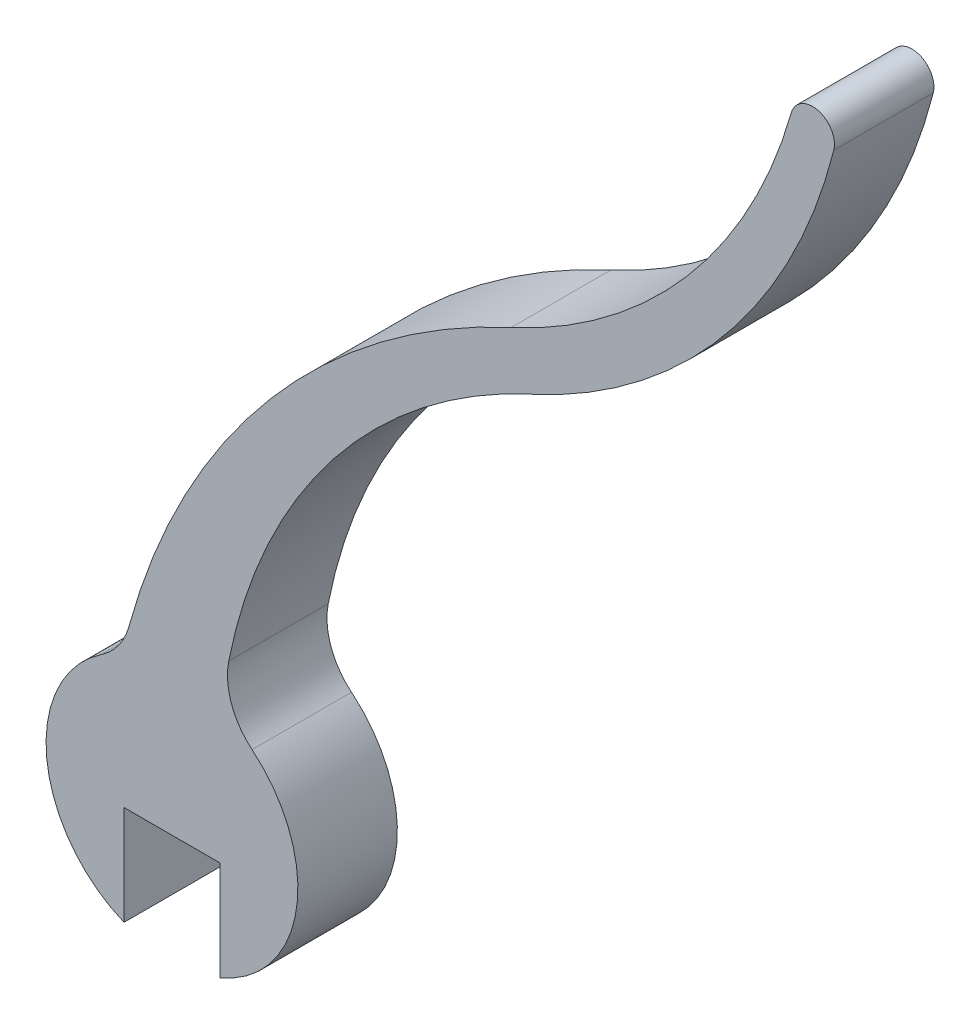
ISO-10303-21;
HEADER;
FILE_DESCRIPTION(('STEP AP214'),'2;1');
FILE_NAME('part.step','',(''),(''),'','','');
FILE_SCHEMA(('AUTOMOTIVE_DESIGN { 1 0 10303 214 1 1 1 1 }'));
ENDSEC;
DATA;
#1=APPLICATION_CONTEXT('core data for automotive mechanical design processes');
#2=APPLICATION_PROTOCOL_DEFINITION('international standard','automotive_design',2000,#1);
#3=PRODUCT_CONTEXT('',#1,'mechanical');
#4=PRODUCT('Part','Part','',(#3));
#5=PRODUCT_RELATED_PRODUCT_CATEGORY('part','',(#4));
#6=PRODUCT_DEFINITION_FORMATION('','',#4);
#7=PRODUCT_DEFINITION_CONTEXT('part definition',#1,'design');
#8=PRODUCT_DEFINITION('design','',#6,#7);
#9=PRODUCT_DEFINITION_SHAPE('','',#8);
#10=(LENGTH_UNIT() NAMED_UNIT(*) SI_UNIT(.MILLI.,.METRE.));
#11=(NAMED_UNIT(*) PLANE_ANGLE_UNIT() SI_UNIT($,.RADIAN.));
#12=(NAMED_UNIT(*) SI_UNIT($,.STERADIAN.) SOLID_ANGLE_UNIT());
#13=UNCERTAINTY_MEASURE_WITH_UNIT(LENGTH_MEASURE(1.E-05),#10,'distance_accuracy_value','');
#14=(GEOMETRIC_REPRESENTATION_CONTEXT(3) GLOBAL_UNCERTAINTY_ASSIGNED_CONTEXT((#13)) GLOBAL_UNIT_ASSIGNED_CONTEXT((#10,
#11,#12)) REPRESENTATION_CONTEXT('',''));
#15=CARTESIAN_POINT('',(0.,0.,0.));
#16=DIRECTION('',(0.,0.,1.));
#17=DIRECTION('',(1.,0.,0.));
#18=AXIS2_PLACEMENT_3D('',#15,#16,#17);
#19=CARTESIAN_POINT('',(-21.2557120556553,-27.0236523147956,3.));
#20=DIRECTION('',(0.,0.,-1.));
#21=DIRECTION('',(-1.,0.,0.));
#22=AXIS2_PLACEMENT_3D('',#19,#20,#21);
#23=CYLINDRICAL_SURFACE('',#22,3.79772962394274);
#24=CARTESIAN_POINT('',(-21.2557120556553,-27.0236523147956,3.));
#25=DIRECTION('',(0.,0.,1.));
#26=DIRECTION('',(1.,0.,0.));
#27=AXIS2_PLACEMENT_3D('',#24,#25,#26);
#28=CIRCLE('',#27,3.79772962394274);
#29=CARTESIAN_POINT('',(-23.3763798191613,-23.8731732189439,3.));
#30=VERTEX_POINT('',#29);
#31=CARTESIAN_POINT('',(-22.7032120556553,-30.5347054397956,3.));
#32=VERTEX_POINT('',#31);
#33=EDGE_CURVE('E128',#30,#32,#28,.T.);
#34=ORIENTED_EDGE('',*,*,#33,.F.);
#35=DIRECTION('',(0.,0.,-1.));
#36=VECTOR('',#35,1.);
#37=CARTESIAN_POINT('',(-23.3763798191613,-23.8731732189439,3.));
#38=LINE('',#37,#36);
#39=CARTESIAN_POINT('',(-23.3763798191613,-23.8731732189439,0.));
#40=VERTEX_POINT('',#39);
#41=EDGE_CURVE('E156',#30,#40,#38,.T.);
#42=ORIENTED_EDGE('',*,*,#41,.T.);
#43=CARTESIAN_POINT('',(-21.2557120556553,-27.0236523147956,0.));
#44=DIRECTION('',(0.,0.,1.));
#45=DIRECTION('',(1.,0.,0.));
#46=AXIS2_PLACEMENT_3D('',#43,#44,#45);
#47=CIRCLE('',#46,3.79772962394274);
#48=CARTESIAN_POINT('',(-22.7032120556553,-30.5347054397956,0.));
#49=VERTEX_POINT('',#48);
#50=EDGE_CURVE('E152',#40,#49,#47,.T.);
#51=ORIENTED_EDGE('',*,*,#50,.T.);
#52=DIRECTION('',(0.,0.,-1.));
#53=VECTOR('',#52,1.);
#54=CARTESIAN_POINT('',(-22.7032120556553,-30.5347054397956,3.));
#55=LINE('',#54,#53);
#56=EDGE_CURVE('E150',#32,#49,#55,.T.);
#57=ORIENTED_EDGE('',*,*,#56,.F.);
#58=EDGE_LOOP('',(#34,#42,#51,#57));
#59=FACE_BOUND('',#58,.T.);
#60=ADVANCED_FACE('F45',(#59),#23,.T.);
#61=CARTESIAN_POINT('',(-22.7032120556553,-30.5347054397956,3.));
#62=DIRECTION('',(-1.,0.,0.));
#63=DIRECTION('',(0.,0.,1.));
#64=AXIS2_PLACEMENT_3D('',#61,#62,#63);
#65=PLANE('',#64);
#66=DIRECTION('',(0.,1.,0.));
#67=VECTOR('',#66,1.);
#68=CARTESIAN_POINT('',(-22.7032120556553,-30.5347054397956,0.));
#69=LINE('',#68,#67);
#70=CARTESIAN_POINT('',(-22.7032120556553,-27.5347054397956,0.));
#71=VERTEX_POINT('',#70);
#72=EDGE_CURVE('E344',#49,#71,#69,.T.);
#73=ORIENTED_EDGE('',*,*,#72,.T.);
#74=DIRECTION('',(0.,0.,-1.));
#75=VECTOR('',#74,1.);
#76=CARTESIAN_POINT('',(-22.7032120556553,-27.5347054397956,3.));
#77=LINE('',#76,#75);
#78=CARTESIAN_POINT('',(-22.7032120556553,-27.5347054397956,3.));
#79=VERTEX_POINT('',#78);
#80=EDGE_CURVE('E149',#79,#71,#77,.T.);
#81=ORIENTED_EDGE('',*,*,#80,.F.);
#82=DIRECTION('',(0.,1.,0.));
#83=VECTOR('',#82,1.);
#84=CARTESIAN_POINT('',(-22.7032120556553,-30.5347054397956,3.));
#85=LINE('',#84,#83);
#86=EDGE_CURVE('E133',#32,#79,#85,.T.);
#87=ORIENTED_EDGE('',*,*,#86,.F.);
#88=ORIENTED_EDGE('',*,*,#56,.T.);
#89=EDGE_LOOP('',(#73,#81,#87,#88));
#90=FACE_BOUND('',#89,.T.);
#91=ADVANCED_FACE('F148',(#90),#65,.F.);
#92=CARTESIAN_POINT('',(-22.7032120556553,-27.5347054397956,3.));
#93=DIRECTION('',(0.,1.,0.));
#94=DIRECTION('',(0.,0.,1.));
#95=AXIS2_PLACEMENT_3D('',#92,#93,#94);
#96=PLANE('',#95);
#97=DIRECTION('',(1.,0.,0.));
#98=VECTOR('',#97,1.);
#99=CARTESIAN_POINT('',(-22.7032120556553,-27.5347054397956,0.));
#100=LINE('',#99,#98);
#101=CARTESIAN_POINT('',(-19.8082120556553,-27.5347054397956,0.));
#102=VERTEX_POINT('',#101);
#103=EDGE_CURVE('E339',#71,#102,#100,.T.);
#104=ORIENTED_EDGE('',*,*,#103,.T.);
#105=DIRECTION('',(0.,0.,-1.));
#106=VECTOR('',#105,1.);
#107=CARTESIAN_POINT('',(-19.8082120556553,-27.5347054397956,3.));
#108=LINE('',#107,#106);
#109=CARTESIAN_POINT('',(-19.8082120556553,-27.5347054397956,3.));
#110=VERTEX_POINT('',#109);
#111=EDGE_CURVE('E159',#110,#102,#108,.T.);
#112=ORIENTED_EDGE('',*,*,#111,.F.);
#113=DIRECTION('',(1.,0.,0.));
#114=VECTOR('',#113,1.);
#115=CARTESIAN_POINT('',(-22.7032120556553,-27.5347054397956,3.));
#116=LINE('',#115,#114);
#117=EDGE_CURVE('E151',#79,#110,#116,.T.);
#118=ORIENTED_EDGE('',*,*,#117,.F.);
#119=ORIENTED_EDGE('',*,*,#80,.T.);
#120=EDGE_LOOP('',(#104,#112,#118,#119));
#121=FACE_BOUND('',#120,.T.);
#122=ADVANCED_FACE('F199',(#121),#96,.F.);
#123=CARTESIAN_POINT('',(-19.8082120556553,-30.5347054397956,3.));
#124=DIRECTION('',(1.,0.,0.));
#125=DIRECTION('',(0.,0.,-1.));
#126=AXIS2_PLACEMENT_3D('',#123,#124,#125);
#127=PLANE('',#126);
#128=DIRECTION('',(0.,-1.,0.));
#129=VECTOR('',#128,1.);
#130=CARTESIAN_POINT('',(-19.8082120556553,-30.5347054397956,0.));
#131=LINE('',#130,#129);
#132=CARTESIAN_POINT('',(-19.8082120556553,-30.5347054397956,0.));
#133=VERTEX_POINT('',#132);
#134=EDGE_CURVE('E340',#102,#133,#131,.T.);
#135=ORIENTED_EDGE('',*,*,#134,.T.);
#136=DIRECTION('',(0.,0.,-1.));
#137=VECTOR('',#136,1.);
#138=CARTESIAN_POINT('',(-19.8082120556553,-30.5347054397956,3.));
#139=LINE('',#138,#137);
#140=CARTESIAN_POINT('',(-19.8082120556553,-30.5347054397956,3.));
#141=VERTEX_POINT('',#140);
#142=EDGE_CURVE('E329',#141,#133,#139,.T.);
#143=ORIENTED_EDGE('',*,*,#142,.F.);
#144=DIRECTION('',(0.,-1.,0.));
#145=VECTOR('',#144,1.);
#146=CARTESIAN_POINT('',(-19.8082120556553,-30.5347054397956,3.));
#147=LINE('',#146,#145);
#148=EDGE_CURVE('E337',#110,#141,#147,.T.);
#149=ORIENTED_EDGE('',*,*,#148,.F.);
#150=ORIENTED_EDGE('',*,*,#111,.T.);
#151=EDGE_LOOP('',(#135,#143,#149,#150));
#152=FACE_BOUND('',#151,.T.);
#153=ADVANCED_FACE('F202',(#152),#127,.F.);
#154=CARTESIAN_POINT('',(-21.2557120556553,-27.0236523147956,3.));
#155=DIRECTION('',(0.,0.,-1.));
#156=DIRECTION('',(-1.,0.,0.));
#157=AXIS2_PLACEMENT_3D('',#154,#155,#156);
#158=CYLINDRICAL_SURFACE('',#157,3.79772962394274);
#159=CARTESIAN_POINT('',(-21.2557120556553,-27.0236523147956,0.));
#160=DIRECTION('',(0.,0.,1.));
#161=DIRECTION('',(-1.,0.,0.));
#162=AXIS2_PLACEMENT_3D('',#159,#160,#161);
#163=CIRCLE('',#162,3.79772962394274);
#164=CARTESIAN_POINT('',(-18.8412101866553,-24.0922821537331,0.));
#165=VERTEX_POINT('',#164);
#166=EDGE_CURVE('E343',#133,#165,#163,.T.);
#167=ORIENTED_EDGE('',*,*,#166,.T.);
#168=DIRECTION('',(0.,0.,-1.));
#169=VECTOR('',#168,1.);
#170=CARTESIAN_POINT('',(-18.8412101866553,-24.0922821537331,3.));
#171=LINE('',#170,#169);
#172=CARTESIAN_POINT('',(-18.8412101866553,-24.0922821537331,3.));
#173=VERTEX_POINT('',#172);
#174=EDGE_CURVE('E60',#165,#173,#171,.F.);
#175=ORIENTED_EDGE('',*,*,#174,.T.);
#176=CARTESIAN_POINT('',(-21.2557120556553,-27.0236523147956,3.));
#177=DIRECTION('',(0.,0.,1.));
#178=DIRECTION('',(-1.,0.,0.));
#179=AXIS2_PLACEMENT_3D('',#176,#177,#178);
#180=CIRCLE('',#179,3.79772962394274);
#181=EDGE_CURVE('E371',#141,#173,#180,.T.);
#182=ORIENTED_EDGE('',*,*,#181,.F.);
#183=ORIENTED_EDGE('',*,*,#142,.T.);
#184=EDGE_LOOP('',(#167,#175,#182,#183));
#185=FACE_BOUND('',#184,.T.);
#186=ADVANCED_FACE('F207',(#185),#158,.T.);
#187=CARTESIAN_POINT('',(-3.76442317922943,-25.2401997131939,3.));
#188=DIRECTION('',(0.,0.,-1.));
#189=DIRECTION('',(-1.,0.,0.));
#190=AXIS2_PLACEMENT_3D('',#187,#188,#189);
#191=CYLINDRICAL_SURFACE('',#190,16.0819784431486);
#192=CARTESIAN_POINT('',(-3.76442317922943,-25.2401997131939,3.));
#193=DIRECTION('',(0.,0.,-1.));
#194=DIRECTION('',(-1.,0.,0.));
#195=AXIS2_PLACEMENT_3D('',#192,#193,#194);
#196=CIRCLE('',#195,16.0819784431486);
#197=CARTESIAN_POINT('',(-19.5429766828782,-22.1309747328512,3.));
#198=VERTEX_POINT('',#197);
#199=CARTESIAN_POINT('',(-10.4266694309731,-10.6031062337144,3.));
#200=VERTEX_POINT('',#199);
#201=EDGE_CURVE('E356',#198,#200,#196,.T.);
#202=ORIENTED_EDGE('',*,*,#201,.F.);
#203=DIRECTION('',(0.,0.,-1.));
#204=VECTOR('',#203,1.);
#205=CARTESIAN_POINT('',(-19.5429766828782,-22.1309747328512,3.));
#206=LINE('',#205,#204);
#207=CARTESIAN_POINT('',(-19.5429766828782,-22.1309747328512,0.));
#208=VERTEX_POINT('',#207);
#209=EDGE_CURVE('E164',#198,#208,#206,.T.);
#210=ORIENTED_EDGE('',*,*,#209,.T.);
#211=CARTESIAN_POINT('',(-3.76442317922943,-25.2401997131939,0.));
#212=DIRECTION('',(0.,0.,-1.));
#213=DIRECTION('',(-1.,0.,0.));
#214=AXIS2_PLACEMENT_3D('',#211,#212,#213);
#215=CIRCLE('',#214,16.0819784431486);
#216=CARTESIAN_POINT('',(-10.4266694309731,-10.6031062337144,0.));
#217=VERTEX_POINT('',#216);
#218=EDGE_CURVE('E341',#208,#217,#215,.T.);
#219=ORIENTED_EDGE('',*,*,#218,.T.);
#220=DIRECTION('',(0.,0.,-1.));
#221=VECTOR('',#220,1.);
#222=CARTESIAN_POINT('',(-10.4266694309731,-10.6031062337144,3.));
#223=LINE('',#222,#221);
#224=EDGE_CURVE('E330',#200,#217,#223,.T.);
#225=ORIENTED_EDGE('',*,*,#224,.F.);
#226=EDGE_LOOP('',(#202,#210,#219,#225));
#227=FACE_BOUND('',#226,.T.);
#228=ADVANCED_FACE('F215',(#227),#191,.F.);
#229=CARTESIAN_POINT('',(-17.2387893835131,4.36326288130592,3.));
#230=DIRECTION('',(0.,0.,-1.));
#231=DIRECTION('',(-1.,0.,0.));
#232=AXIS2_PLACEMENT_3D('',#229,#230,#231);
#233=CYLINDRICAL_SURFACE('',#232,16.443758169434);
#234=CARTESIAN_POINT('',(-17.2387893835131,4.36326288130592,0.));
#235=DIRECTION('',(0.,0.,1.));
#236=DIRECTION('',(1.,0.,0.));
#237=AXIS2_PLACEMENT_3D('',#234,#235,#236);
#238=CIRCLE('',#237,16.443758169434);
#239=CARTESIAN_POINT('',(-1.2963160179787,0.334028993325268,0.));
#240=VERTEX_POINT('',#239);
#241=EDGE_CURVE('E320',#217,#240,#238,.T.);
#242=ORIENTED_EDGE('',*,*,#241,.T.);
#243=DIRECTION('',(0.,0.,-1.));
#244=VECTOR('',#243,1.);
#245=CARTESIAN_POINT('',(-1.2963160179787,0.334028993325268,3.));
#246=LINE('',#245,#244);
#247=CARTESIAN_POINT('',(-1.2963160179787,0.334028993325268,3.));
#248=VERTEX_POINT('',#247);
#249=EDGE_CURVE('E322',#248,#240,#246,.T.);
#250=ORIENTED_EDGE('',*,*,#249,.F.);
#251=CARTESIAN_POINT('',(-17.2387893835131,4.36326288130592,3.));
#252=DIRECTION('',(0.,0.,1.));
#253=DIRECTION('',(1.,0.,0.));
#254=AXIS2_PLACEMENT_3D('',#251,#252,#253);
#255=CIRCLE('',#254,16.443758169434);
#256=EDGE_CURVE('E358',#200,#248,#255,.T.);
#257=ORIENTED_EDGE('',*,*,#256,.F.);
#258=ORIENTED_EDGE('',*,*,#224,.T.);
#259=EDGE_LOOP('',(#242,#250,#257,#258));
#260=FACE_BOUND('',#259,.T.);
#261=ADVANCED_FACE('F214',(#260),#233,.T.);
#262=CARTESIAN_POINT('',(-1.93864895695925,0.496369527680609,3.));
#263=DIRECTION('',(0.,0.,-1.));
#264=DIRECTION('',(-1.,0.,0.));
#265=AXIS2_PLACEMENT_3D('',#262,#263,#264);
#266=CYLINDRICAL_SURFACE('',#265,0.662530039767387);
#267=CARTESIAN_POINT('',(-1.93864895695925,0.496369527680609,0.));
#268=DIRECTION('',(0.,0.,1.));
#269=DIRECTION('',(-1.,0.,0.));
#270=AXIS2_PLACEMENT_3D('',#267,#268,#269);
#271=CIRCLE('',#270,0.662530039767387);
#272=CARTESIAN_POINT('',(-2.57580341599654,0.677974177739668,0.));
#273=VERTEX_POINT('',#272);
#274=EDGE_CURVE('E312',#240,#273,#271,.T.);
#275=ORIENTED_EDGE('',*,*,#274,.T.);
#276=DIRECTION('',(0.,0.,-1.));
#277=VECTOR('',#276,1.);
#278=CARTESIAN_POINT('',(-2.57580341599654,0.677974177739668,3.));
#279=LINE('',#278,#277);
#280=CARTESIAN_POINT('',(-2.57580341599654,0.677974177739668,3.));
#281=VERTEX_POINT('',#280);
#282=EDGE_CURVE('E311',#281,#273,#279,.T.);
#283=ORIENTED_EDGE('',*,*,#282,.F.);
#284=CARTESIAN_POINT('',(-1.93864895695925,0.496369527680609,3.));
#285=DIRECTION('',(0.,0.,1.));
#286=DIRECTION('',(-1.,0.,0.));
#287=AXIS2_PLACEMENT_3D('',#284,#285,#286);
#288=CIRCLE('',#287,0.662530039767387);
#289=EDGE_CURVE('E353',#248,#281,#288,.T.);
#290=ORIENTED_EDGE('',*,*,#289,.F.);
#291=ORIENTED_EDGE('',*,*,#249,.T.);
#292=EDGE_LOOP('',(#275,#283,#290,#291));
#293=FACE_BOUND('',#292,.T.);
#294=ADVANCED_FACE('F218',(#293),#266,.T.);
#295=CARTESIAN_POINT('',(-17.470986194247,4.92346664450674,3.));
#296=DIRECTION('',(0.,0.,-1.));
#297=DIRECTION('',(-1.,0.,0.));
#298=AXIS2_PLACEMENT_3D('',#295,#296,#297);
#299=CYLINDRICAL_SURFACE('',#298,15.4884045751286);
#300=CARTESIAN_POINT('',(-17.470986194247,4.92346664450674,0.));
#301=DIRECTION('',(0.,0.,-1.));
#302=DIRECTION('',(1.,0.,0.));
#303=AXIS2_PLACEMENT_3D('',#300,#301,#302);
#304=CIRCLE('',#303,15.4884045751286);
#305=CARTESIAN_POINT('',(-11.0258219986244,-9.16023083784243,0.));
#306=VERTEX_POINT('',#305);
#307=EDGE_CURVE('E181',#273,#306,#304,.T.);
#308=ORIENTED_EDGE('',*,*,#307,.T.);
#309=DIRECTION('',(0.,0.,-1.));
#310=VECTOR('',#309,1.);
#311=CARTESIAN_POINT('',(-11.0258219986244,-9.16023083784243,3.));
#312=LINE('',#311,#310);
#313=CARTESIAN_POINT('',(-11.0258219986244,-9.16023083784243,3.));
#314=VERTEX_POINT('',#313);
#315=EDGE_CURVE('E185',#314,#306,#312,.T.);
#316=ORIENTED_EDGE('',*,*,#315,.F.);
#317=CARTESIAN_POINT('',(-17.470986194247,4.92346664450674,3.));
#318=DIRECTION('',(0.,0.,-1.));
#319=DIRECTION('',(1.,0.,0.));
#320=AXIS2_PLACEMENT_3D('',#317,#318,#319);
#321=CIRCLE('',#320,15.4884045751286);
#322=EDGE_CURVE('E354',#281,#314,#321,.T.);
#323=ORIENTED_EDGE('',*,*,#322,.F.);
#324=ORIENTED_EDGE('',*,*,#282,.T.);
#325=EDGE_LOOP('',(#308,#316,#323,#324));
#326=FACE_BOUND('',#325,.T.);
#327=ADVANCED_FACE('F224',(#326),#299,.F.);
#328=CARTESIAN_POINT('',(-2.28076648324697,-28.269552587717,3.));
#329=DIRECTION('',(0.,0.,-1.));
#330=DIRECTION('',(-1.,0.,0.));
#331=AXIS2_PLACEMENT_3D('',#328,#329,#330);
#332=CYLINDRICAL_SURFACE('',#331,21.0152842880429);
#333=CARTESIAN_POINT('',(-2.28076648324697,-28.269552587717,0.));
#334=DIRECTION('',(0.,0.,1.));
#335=DIRECTION('',(-1.,0.,0.));
#336=AXIS2_PLACEMENT_3D('',#333,#334,#335);
#337=CIRCLE('',#336,21.0152842880429);
#338=CARTESIAN_POINT('',(-22.5510884788962,-22.723723533377,0.));
#339=VERTEX_POINT('',#338);
#340=EDGE_CURVE('E142',#306,#339,#337,.T.);
#341=ORIENTED_EDGE('',*,*,#340,.T.);
#342=DIRECTION('',(0.,0.,-1.));
#343=VECTOR('',#342,1.);
#344=CARTESIAN_POINT('',(-22.5510884788962,-22.723723533377,3.));
#345=LINE('',#344,#343);
#346=CARTESIAN_POINT('',(-22.5510884788962,-22.723723533377,3.));
#347=VERTEX_POINT('',#346);
#348=EDGE_CURVE('E158',#339,#347,#345,.F.);
#349=ORIENTED_EDGE('',*,*,#348,.T.);
#350=CARTESIAN_POINT('',(-2.28076648324697,-28.269552587717,3.));
#351=DIRECTION('',(0.,0.,1.));
#352=DIRECTION('',(-1.,0.,0.));
#353=AXIS2_PLACEMENT_3D('',#350,#351,#352);
#354=CIRCLE('',#353,21.0152842880429);
#355=EDGE_CURVE('E325',#314,#347,#354,.T.);
#356=ORIENTED_EDGE('',*,*,#355,.F.);
#357=ORIENTED_EDGE('',*,*,#315,.T.);
#358=EDGE_LOOP('',(#341,#349,#356,#357));
#359=FACE_BOUND('',#358,.T.);
#360=ADVANCED_FACE('F177',(#359),#332,.T.);
#361=CARTESIAN_POINT('',(-21.2557120556553,-27.0236523147956,3.));
#362=DIRECTION('',(0.,0.,1.));
#363=DIRECTION('',(1.,0.,0.));
#364=AXIS2_PLACEMENT_3D('',#361,#362,#363);
#365=PLANE('',#364);
#366=ORIENTED_EDGE('',*,*,#355,.T.);
#367=CARTESIAN_POINT('',(-24.5110569347402,-22.187488834671,3.));
#368=DIRECTION('',(0.,0.,1.));
#369=DIRECTION('',(1.,0.,0.));
#370=AXIS2_PLACEMENT_3D('',#367,#368,#369);
#371=CIRCLE('',#370,2.032);
#372=EDGE_CURVE('E140',#347,#30,#371,.F.);
#373=ORIENTED_EDGE('',*,*,#372,.T.);
#374=ORIENTED_EDGE('',*,*,#33,.T.);
#375=ORIENTED_EDGE('',*,*,#86,.T.);
#376=ORIENTED_EDGE('',*,*,#117,.T.);
#377=ORIENTED_EDGE('',*,*,#148,.T.);
#378=ORIENTED_EDGE('',*,*,#181,.T.);
#379=CARTESIAN_POINT('',(-17.5493152168617,-22.5238334338121,3.));
#380=DIRECTION('',(0.,0.,1.));
#381=DIRECTION('',(1.,0.,0.));
#382=AXIS2_PLACEMENT_3D('',#379,#380,#381);
#383=CIRCLE('',#382,2.032);
#384=EDGE_CURVE('E12',#173,#198,#383,.F.);
#385=ORIENTED_EDGE('',*,*,#384,.T.);
#386=ORIENTED_EDGE('',*,*,#201,.T.);
#387=ORIENTED_EDGE('',*,*,#256,.T.);
#388=ORIENTED_EDGE('',*,*,#289,.T.);
#389=ORIENTED_EDGE('',*,*,#322,.T.);
#390=EDGE_LOOP('',(#366,#373,#374,#375,#376,#377,#378,#385,#386,#387,#388,#389));
#391=FACE_BOUND('',#390,.T.);
#392=ADVANCED_FACE('F132',(#391),#365,.T.);
#393=CARTESIAN_POINT('',(-21.2557120556553,-27.0236523147956,0.));
#394=DIRECTION('',(0.,0.,1.));
#395=DIRECTION('',(1.,0.,0.));
#396=AXIS2_PLACEMENT_3D('',#393,#394,#395);
#397=PLANE('',#396);
#398=ORIENTED_EDGE('',*,*,#50,.F.);
#399=CARTESIAN_POINT('',(-24.5110569347402,-22.187488834671,0.));
#400=DIRECTION('',(0.,0.,1.));
#401=DIRECTION('',(1.,0.,0.));
#402=AXIS2_PLACEMENT_3D('',#399,#400,#401);
#403=CIRCLE('',#402,2.032);
#404=EDGE_CURVE('E166',#40,#339,#403,.T.);
#405=ORIENTED_EDGE('',*,*,#404,.T.);
#406=ORIENTED_EDGE('',*,*,#340,.F.);
#407=ORIENTED_EDGE('',*,*,#307,.F.);
#408=ORIENTED_EDGE('',*,*,#274,.F.);
#409=ORIENTED_EDGE('',*,*,#241,.F.);
#410=ORIENTED_EDGE('',*,*,#218,.F.);
#411=CARTESIAN_POINT('',(-17.5493152168617,-22.5238334338121,0.));
#412=DIRECTION('',(0.,0.,1.));
#413=DIRECTION('',(1.,0.,0.));
#414=AXIS2_PLACEMENT_3D('',#411,#412,#413);
#415=CIRCLE('',#414,2.032);
#416=EDGE_CURVE('E49',#208,#165,#415,.T.);
#417=ORIENTED_EDGE('',*,*,#416,.T.);
#418=ORIENTED_EDGE('',*,*,#166,.F.);
#419=ORIENTED_EDGE('',*,*,#134,.F.);
#420=ORIENTED_EDGE('',*,*,#103,.F.);
#421=ORIENTED_EDGE('',*,*,#72,.F.);
#422=EDGE_LOOP('',(#398,#405,#406,#407,#408,#409,#410,#417,#418,#419,#420,#421));
#423=FACE_BOUND('',#422,.T.);
#424=ADVANCED_FACE('F172',(#423),#397,.F.);
#425=CARTESIAN_POINT('',(-24.5110569347402,-22.187488834671,3.));
#426=DIRECTION('',(0.,0.,1.));
#427=DIRECTION('',(1.,0.,0.));
#428=AXIS2_PLACEMENT_3D('',#425,#426,#427);
#429=CYLINDRICAL_SURFACE('',#428,2.032);
#430=ORIENTED_EDGE('',*,*,#372,.F.);
#431=ORIENTED_EDGE('',*,*,#348,.F.);
#432=ORIENTED_EDGE('',*,*,#404,.F.);
#433=ORIENTED_EDGE('',*,*,#41,.F.);
#434=EDGE_LOOP('',(#430,#431,#432,#433));
#435=FACE_BOUND('',#434,.T.);
#436=ADVANCED_FACE('F183',(#435),#429,.F.);
#437=CARTESIAN_POINT('',(-17.5493152168617,-22.5238334338121,3.));
#438=DIRECTION('',(0.,0.,-1.));
#439=DIRECTION('',(-1.,0.,0.));
#440=AXIS2_PLACEMENT_3D('',#437,#438,#439);
#441=CYLINDRICAL_SURFACE('',#440,2.032);
#442=ORIENTED_EDGE('',*,*,#384,.F.);
#443=ORIENTED_EDGE('',*,*,#174,.F.);
#444=ORIENTED_EDGE('',*,*,#416,.F.);
#445=ORIENTED_EDGE('',*,*,#209,.F.);
#446=EDGE_LOOP('',(#442,#443,#444,#445));
#447=FACE_BOUND('',#446,.T.);
#448=ADVANCED_FACE('F42',(#447),#441,.F.);
#449=CLOSED_SHELL('',(#60,#91,#122,#153,#186,#228,#261,#294,#327,#360,#392,#424,#436,#448));
#450=MANIFOLD_SOLID_BREP('B2',#449);
#451=ADVANCED_BREP_SHAPE_REPRESENTATION('',(#18,#450),#14);
#452=SHAPE_DEFINITION_REPRESENTATION(#9,#451);
ENDSEC;
END-ISO-10303-21;
